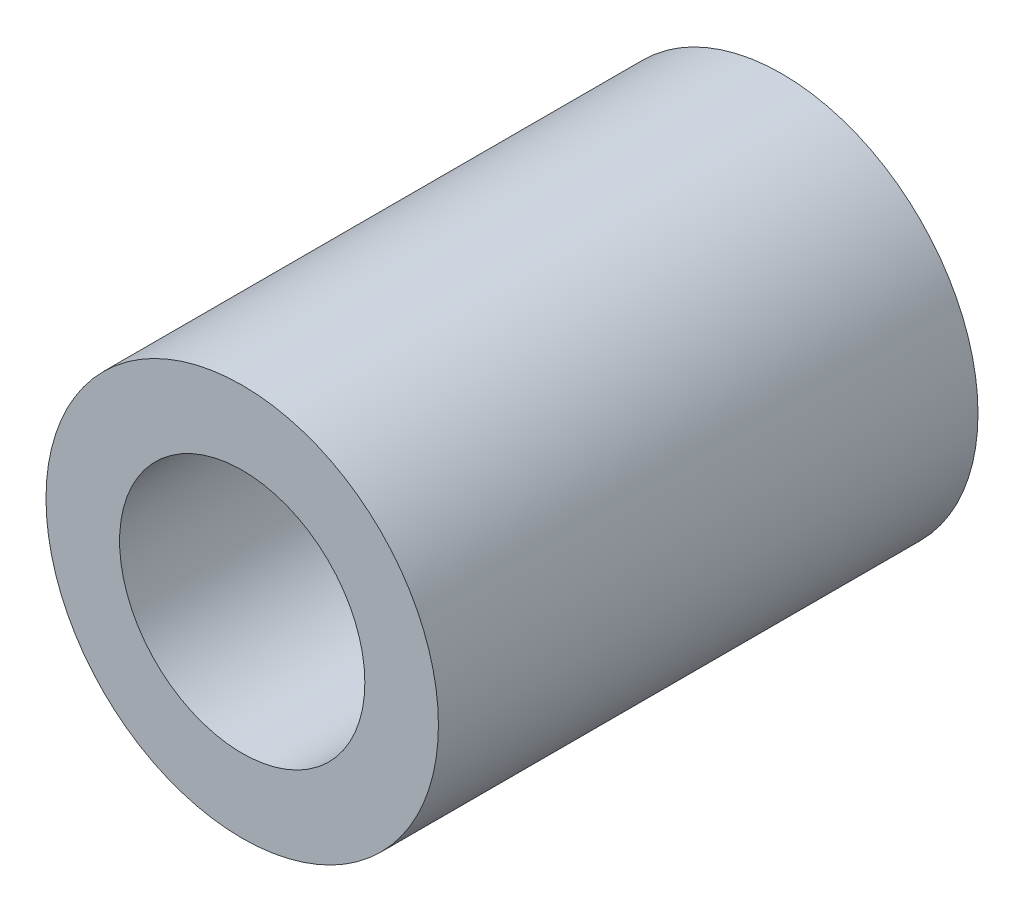
ISO-10303-21;
HEADER;
FILE_DESCRIPTION(('STEP AP214'),'2;1');
FILE_NAME('part.step','',(''),(''),'','','');
FILE_SCHEMA(('AUTOMOTIVE_DESIGN { 1 0 10303 214 1 1 1 1 }'));
ENDSEC;
DATA;
#1=APPLICATION_CONTEXT('core data for automotive mechanical design processes');
#2=APPLICATION_PROTOCOL_DEFINITION('international standard','automotive_design',2000,#1);
#3=PRODUCT_CONTEXT('',#1,'mechanical');
#4=PRODUCT('Part','Part','',(#3));
#5=PRODUCT_RELATED_PRODUCT_CATEGORY('part','',(#4));
#6=PRODUCT_DEFINITION_FORMATION('','',#4);
#7=PRODUCT_DEFINITION_CONTEXT('part definition',#1,'design');
#8=PRODUCT_DEFINITION('design','',#6,#7);
#9=PRODUCT_DEFINITION_SHAPE('','',#8);
#10=(LENGTH_UNIT() NAMED_UNIT(*) SI_UNIT(.MILLI.,.METRE.));
#11=(NAMED_UNIT(*) PLANE_ANGLE_UNIT() SI_UNIT($,.RADIAN.));
#12=(NAMED_UNIT(*) SI_UNIT($,.STERADIAN.) SOLID_ANGLE_UNIT());
#13=UNCERTAINTY_MEASURE_WITH_UNIT(LENGTH_MEASURE(1.E-05),#10,'distance_accuracy_value','');
#14=(GEOMETRIC_REPRESENTATION_CONTEXT(3) GLOBAL_UNCERTAINTY_ASSIGNED_CONTEXT((#13)) GLOBAL_UNIT_ASSIGNED_CONTEXT((#10,
#11,#12)) REPRESENTATION_CONTEXT('',''));
#15=CARTESIAN_POINT('',(0.,0.,0.));
#16=DIRECTION('',(0.,0.,1.));
#17=DIRECTION('',(1.,0.,0.));
#18=AXIS2_PLACEMENT_3D('',#15,#16,#17);
#19=CARTESIAN_POINT('',(0.,0.,11.));
#20=DIRECTION('',(0.,0.,1.));
#21=DIRECTION('',(1.,0.,0.));
#22=AXIS2_PLACEMENT_3D('',#19,#20,#21);
#23=PLANE('',#22);
#24=CARTESIAN_POINT('',(0.,0.,11.));
#25=DIRECTION('',(0.,0.,1.));
#26=DIRECTION('',(1.,0.,0.));
#27=AXIS2_PLACEMENT_3D('',#24,#25,#26);
#28=CIRCLE('',#27,8.);
#29=CARTESIAN_POINT('',(8.,0.,11.));
#30=VERTEX_POINT('',#29);
#31=EDGE_CURVE('E10',#30,#30,#28,.T.);
#32=ORIENTED_EDGE('',*,*,#31,.T.);
#33=EDGE_LOOP('',(#32));
#34=FACE_BOUND('',#33,.T.);
#35=CARTESIAN_POINT('',(0.,0.,11.));
#36=DIRECTION('',(0.,0.,1.));
#37=DIRECTION('',(1.,0.,0.));
#38=AXIS2_PLACEMENT_3D('',#35,#36,#37);
#39=CIRCLE('',#38,5.);
#40=CARTESIAN_POINT('',(5.,0.,11.));
#41=VERTEX_POINT('',#40);
#42=EDGE_CURVE('E44',#41,#41,#39,.T.);
#43=ORIENTED_EDGE('',*,*,#42,.F.);
#44=EDGE_LOOP('',(#43));
#45=FACE_BOUND('',#44,.T.);
#46=ADVANCED_FACE('F33',(#34,#45),#23,.T.);
#47=CARTESIAN_POINT('',(0.,0.,-11.));
#48=DIRECTION('',(0.,0.,1.));
#49=DIRECTION('',(1.,0.,0.));
#50=AXIS2_PLACEMENT_3D('',#47,#48,#49);
#51=PLANE('',#50);
#52=CARTESIAN_POINT('',(0.,0.,-11.));
#53=DIRECTION('',(0.,0.,1.));
#54=DIRECTION('',(1.,0.,0.));
#55=AXIS2_PLACEMENT_3D('',#52,#53,#54);
#56=CIRCLE('',#55,8.);
#57=CARTESIAN_POINT('',(8.,0.,-11.));
#58=VERTEX_POINT('',#57);
#59=EDGE_CURVE('E37',#58,#58,#56,.T.);
#60=ORIENTED_EDGE('',*,*,#59,.F.);
#61=EDGE_LOOP('',(#60));
#62=FACE_BOUND('',#61,.T.);
#63=CARTESIAN_POINT('',(0.,0.,-11.));
#64=DIRECTION('',(0.,0.,1.));
#65=DIRECTION('',(1.,0.,0.));
#66=AXIS2_PLACEMENT_3D('',#63,#64,#65);
#67=CIRCLE('',#66,5.);
#68=CARTESIAN_POINT('',(5.,0.,-11.));
#69=VERTEX_POINT('',#68);
#70=EDGE_CURVE('E46',#69,#69,#67,.T.);
#71=ORIENTED_EDGE('',*,*,#70,.T.);
#72=EDGE_LOOP('',(#71));
#73=FACE_BOUND('',#72,.T.);
#74=ADVANCED_FACE('F56',(#62,#73),#51,.F.);
#75=CARTESIAN_POINT('',(0.,0.,11.));
#76=DIRECTION('',(0.,0.,-1.));
#77=DIRECTION('',(-1.,0.,0.));
#78=AXIS2_PLACEMENT_3D('',#75,#76,#77);
#79=CYLINDRICAL_SURFACE('',#78,8.);
#80=ORIENTED_EDGE('',*,*,#31,.F.);
#81=EDGE_LOOP('',(#80));
#82=FACE_BOUND('',#81,.T.);
#83=ORIENTED_EDGE('',*,*,#59,.T.);
#84=EDGE_LOOP('',(#83));
#85=FACE_BOUND('',#84,.T.);
#86=ADVANCED_FACE('F35',(#82,#85),#79,.T.);
#87=CARTESIAN_POINT('',(0.,0.,11.));
#88=DIRECTION('',(0.,0.,-1.));
#89=DIRECTION('',(-1.,0.,0.));
#90=AXIS2_PLACEMENT_3D('',#87,#88,#89);
#91=CYLINDRICAL_SURFACE('',#90,5.);
#92=ORIENTED_EDGE('',*,*,#42,.T.);
#93=EDGE_LOOP('',(#92));
#94=FACE_BOUND('',#93,.T.);
#95=ORIENTED_EDGE('',*,*,#70,.F.);
#96=EDGE_LOOP('',(#95));
#97=FACE_BOUND('',#96,.T.);
#98=ADVANCED_FACE('F52',(#94,#97),#91,.F.);
#99=CLOSED_SHELL('',(#46,#74,#86,#98));
#100=MANIFOLD_SOLID_BREP('B2',#99);
#101=ADVANCED_BREP_SHAPE_REPRESENTATION('',(#18,#100),#14);
#102=SHAPE_DEFINITION_REPRESENTATION(#9,#101);
ENDSEC;
END-ISO-10303-21;
